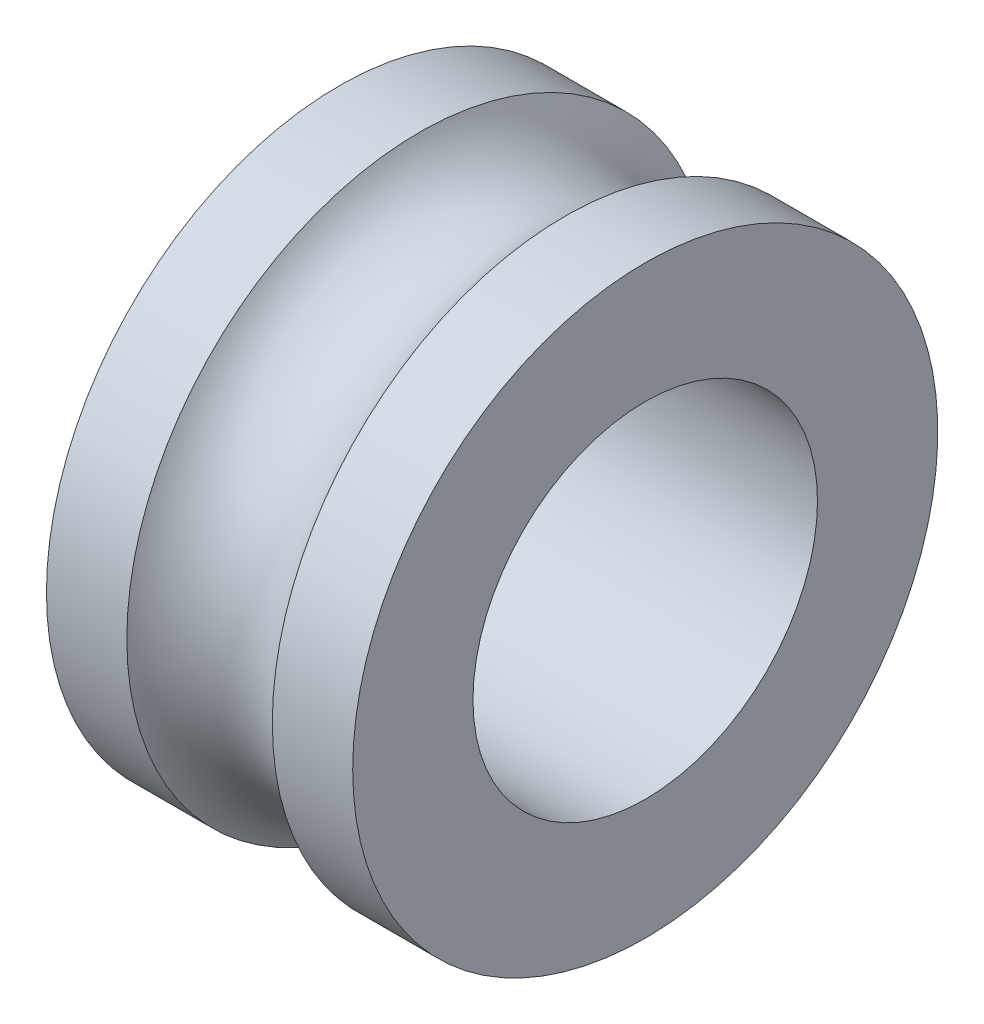
ISO-10303-21;
HEADER;
FILE_DESCRIPTION(('STEP AP214'),'2;1');
FILE_NAME('part.step','',(''),(''),'','','');
FILE_SCHEMA(('AUTOMOTIVE_DESIGN { 1 0 10303 214 1 1 1 1 }'));
ENDSEC;
DATA;
#1=APPLICATION_CONTEXT('core data for automotive mechanical design processes');
#2=APPLICATION_PROTOCOL_DEFINITION('international standard','automotive_design',2000,#1);
#3=PRODUCT_CONTEXT('',#1,'mechanical');
#4=PRODUCT('Part','Part','',(#3));
#5=PRODUCT_RELATED_PRODUCT_CATEGORY('part','',(#4));
#6=PRODUCT_DEFINITION_FORMATION('','',#4);
#7=PRODUCT_DEFINITION_CONTEXT('part definition',#1,'design');
#8=PRODUCT_DEFINITION('design','',#6,#7);
#9=PRODUCT_DEFINITION_SHAPE('','',#8);
#10=(LENGTH_UNIT() NAMED_UNIT(*) SI_UNIT(.MILLI.,.METRE.));
#11=(NAMED_UNIT(*) PLANE_ANGLE_UNIT() SI_UNIT($,.RADIAN.));
#12=(NAMED_UNIT(*) SI_UNIT($,.STERADIAN.) SOLID_ANGLE_UNIT());
#13=UNCERTAINTY_MEASURE_WITH_UNIT(LENGTH_MEASURE(1.E-05),#10,'distance_accuracy_value','');
#14=(GEOMETRIC_REPRESENTATION_CONTEXT(3) GLOBAL_UNCERTAINTY_ASSIGNED_CONTEXT((#13)) GLOBAL_UNIT_ASSIGNED_CONTEXT((#10,
#11,#12)) REPRESENTATION_CONTEXT('',''));
#15=CARTESIAN_POINT('',(0.,0.,0.));
#16=DIRECTION('',(0.,0.,1.));
#17=DIRECTION('',(1.,0.,0.));
#18=AXIS2_PLACEMENT_3D('',#15,#16,#17);
#19=CARTESIAN_POINT('',(-4.,-4.5,0.));
#20=DIRECTION('',(-1.,0.,0.));
#21=DIRECTION('',(0.,0.,1.));
#22=AXIS2_PLACEMENT_3D('',#19,#20,#21);
#23=CYLINDRICAL_SURFACE('',#22,4.5);
#24=CARTESIAN_POINT('',(4.,-4.5,0.));
#25=DIRECTION('',(-1.,0.,0.));
#26=DIRECTION('',(0.,0.,1.));
#27=AXIS2_PLACEMENT_3D('',#24,#25,#26);
#28=CIRCLE('',#27,4.5);
#29=CARTESIAN_POINT('',(4.,-4.5,4.5));
#30=VERTEX_POINT('',#29);
#31=EDGE_CURVE('E10',#30,#30,#28,.T.);
#32=ORIENTED_EDGE('',*,*,#31,.F.);
#33=EDGE_LOOP('',(#32));
#34=FACE_BOUND('',#33,.T.);
#35=CARTESIAN_POINT('',(-4.,-4.5,0.));
#36=DIRECTION('',(-1.,0.,0.));
#37=DIRECTION('',(0.,0.,1.));
#38=AXIS2_PLACEMENT_3D('',#35,#36,#37);
#39=CIRCLE('',#38,4.5);
#40=CARTESIAN_POINT('',(-4.,-4.5,4.5));
#41=VERTEX_POINT('',#40);
#42=EDGE_CURVE('E56',#41,#41,#39,.T.);
#43=ORIENTED_EDGE('',*,*,#42,.T.);
#44=EDGE_LOOP('',(#43));
#45=FACE_BOUND('',#44,.T.);
#46=ADVANCED_FACE('F34',(#34,#45),#23,.F.);
#47=CARTESIAN_POINT('',(4.,0.,0.));
#48=DIRECTION('',(-1.,0.,0.));
#49=DIRECTION('',(0.,0.,1.));
#50=AXIS2_PLACEMENT_3D('',#47,#48,#49);
#51=PLANE('',#50);
#52=CARTESIAN_POINT('',(4.,-4.5,0.));
#53=DIRECTION('',(-1.,0.,0.));
#54=DIRECTION('',(0.,0.,1.));
#55=AXIS2_PLACEMENT_3D('',#52,#53,#54);
#56=CIRCLE('',#55,7.642);
#57=CARTESIAN_POINT('',(4.,-4.5,7.642));
#58=VERTEX_POINT('',#57);
#59=EDGE_CURVE('E40',#58,#58,#56,.T.);
#60=ORIENTED_EDGE('',*,*,#59,.F.);
#61=EDGE_LOOP('',(#60));
#62=FACE_BOUND('',#61,.T.);
#63=ORIENTED_EDGE('',*,*,#31,.T.);
#64=EDGE_LOOP('',(#63));
#65=FACE_BOUND('',#64,.T.);
#66=ADVANCED_FACE('F81',(#62,#65),#51,.F.);
#67=CARTESIAN_POINT('',(-4.,-4.5,0.));
#68=DIRECTION('',(-1.,0.,0.));
#69=DIRECTION('',(0.,0.,1.));
#70=AXIS2_PLACEMENT_3D('',#67,#68,#69);
#71=CYLINDRICAL_SURFACE('',#70,7.642);
#72=CARTESIAN_POINT('',(1.9,-4.5,0.));
#73=DIRECTION('',(-1.,0.,0.));
#74=DIRECTION('',(0.,0.,1.));
#75=AXIS2_PLACEMENT_3D('',#72,#73,#74);
#76=CIRCLE('',#75,7.642);
#77=CARTESIAN_POINT('',(1.9,-4.5,7.642));
#78=VERTEX_POINT('',#77);
#79=EDGE_CURVE('E44',#78,#78,#76,.T.);
#80=ORIENTED_EDGE('',*,*,#79,.F.);
#81=EDGE_LOOP('',(#80));
#82=FACE_BOUND('',#81,.T.);
#83=ORIENTED_EDGE('',*,*,#59,.T.);
#84=EDGE_LOOP('',(#83));
#85=FACE_BOUND('',#84,.T.);
#86=ADVANCED_FACE('F76',(#82,#85),#71,.T.);
#87=CARTESIAN_POINT('',(0.,-4.5,0.));
#88=DIRECTION('',(-1.,0.,0.));
#89=DIRECTION('',(0.,0.,1.));
#90=AXIS2_PLACEMENT_3D('',#87,#88,#89);
#91=TOROIDAL_SURFACE('',#90,8.75105365064094,2.2);
#92=CARTESIAN_POINT('',(-1.9,-4.5,0.));
#93=DIRECTION('',(-1.,0.,0.));
#94=DIRECTION('',(0.,0.,1.));
#95=AXIS2_PLACEMENT_3D('',#92,#93,#94);
#96=CIRCLE('',#95,7.642);
#97=CARTESIAN_POINT('',(-1.9,-4.5,7.642));
#98=VERTEX_POINT('',#97);
#99=EDGE_CURVE('E48',#98,#98,#96,.T.);
#100=ORIENTED_EDGE('',*,*,#99,.F.);
#101=EDGE_LOOP('',(#100));
#102=FACE_BOUND('',#101,.T.);
#103=ORIENTED_EDGE('',*,*,#79,.T.);
#104=EDGE_LOOP('',(#103));
#105=FACE_BOUND('',#104,.T.);
#106=ADVANCED_FACE('F70',(#102,#105),#91,.F.);
#107=CARTESIAN_POINT('',(-4.,-4.5,0.));
#108=DIRECTION('',(-1.,0.,0.));
#109=DIRECTION('',(0.,0.,1.));
#110=AXIS2_PLACEMENT_3D('',#107,#108,#109);
#111=CYLINDRICAL_SURFACE('',#110,7.642);
#112=CARTESIAN_POINT('',(-4.,-4.5,0.));
#113=DIRECTION('',(-1.,0.,0.));
#114=DIRECTION('',(0.,0.,1.));
#115=AXIS2_PLACEMENT_3D('',#112,#113,#114);
#116=CIRCLE('',#115,7.642);
#117=CARTESIAN_POINT('',(-4.,-4.5,7.642));
#118=VERTEX_POINT('',#117);
#119=EDGE_CURVE('E53',#118,#118,#116,.T.);
#120=ORIENTED_EDGE('',*,*,#119,.F.);
#121=EDGE_LOOP('',(#120));
#122=FACE_BOUND('',#121,.T.);
#123=ORIENTED_EDGE('',*,*,#99,.T.);
#124=EDGE_LOOP('',(#123));
#125=FACE_BOUND('',#124,.T.);
#126=ADVANCED_FACE('F64',(#122,#125),#111,.T.);
#127=CARTESIAN_POINT('',(-4.,0.,0.));
#128=DIRECTION('',(1.,0.,0.));
#129=DIRECTION('',(0.,0.,-1.));
#130=AXIS2_PLACEMENT_3D('',#127,#128,#129);
#131=PLANE('',#130);
#132=ORIENTED_EDGE('',*,*,#42,.F.);
#133=EDGE_LOOP('',(#132));
#134=FACE_BOUND('',#133,.T.);
#135=ORIENTED_EDGE('',*,*,#119,.T.);
#136=EDGE_LOOP('',(#135));
#137=FACE_BOUND('',#136,.T.);
#138=ADVANCED_FACE('F61',(#134,#137),#131,.F.);
#139=CLOSED_SHELL('',(#46,#66,#86,#106,#126,#138));
#140=MANIFOLD_SOLID_BREP('B2',#139);
#141=ADVANCED_BREP_SHAPE_REPRESENTATION('',(#18,#140),#14);
#142=SHAPE_DEFINITION_REPRESENTATION(#9,#141);
ENDSEC;
END-ISO-10303-21;
